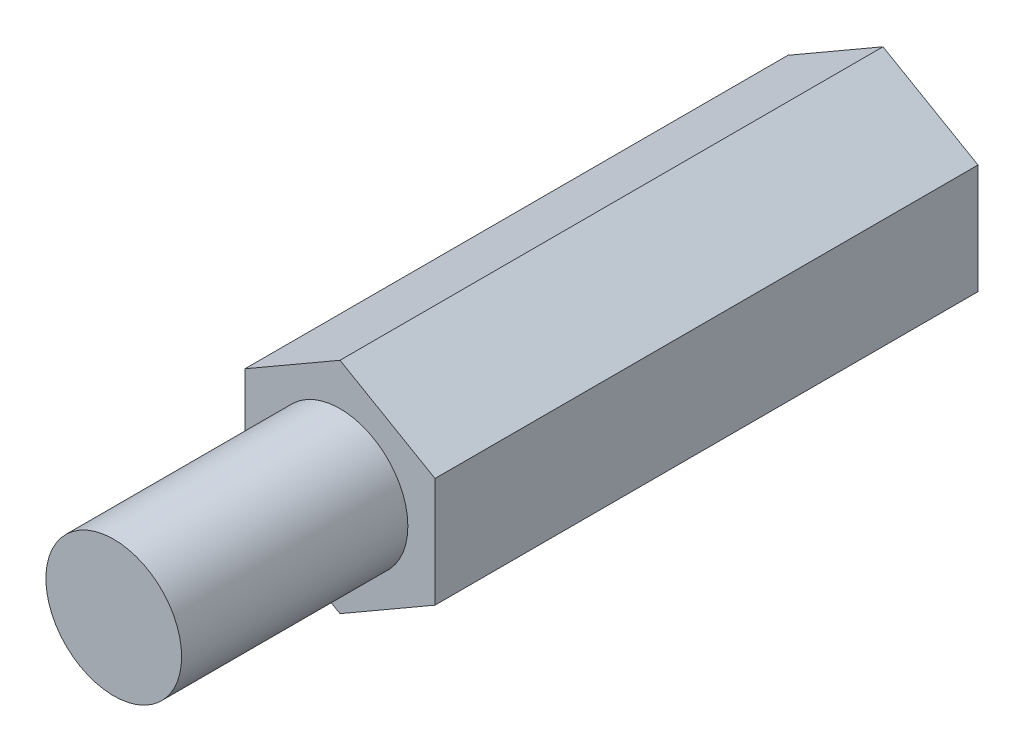
ISO-10303-21;
HEADER;
FILE_DESCRIPTION(('STEP AP214'),'2;1');
FILE_NAME('part.step','',(''),(''),'','','');
FILE_SCHEMA(('AUTOMOTIVE_DESIGN { 1 0 10303 214 1 1 1 1 }'));
ENDSEC;
DATA;
#1=APPLICATION_CONTEXT('core data for automotive mechanical design processes');
#2=APPLICATION_PROTOCOL_DEFINITION('international standard','automotive_design',2000,#1);
#3=PRODUCT_CONTEXT('',#1,'mechanical');
#4=PRODUCT('Part','Part','',(#3));
#5=PRODUCT_RELATED_PRODUCT_CATEGORY('part','',(#4));
#6=PRODUCT_DEFINITION_FORMATION('','',#4);
#7=PRODUCT_DEFINITION_CONTEXT('part definition',#1,'design');
#8=PRODUCT_DEFINITION('design','',#6,#7);
#9=PRODUCT_DEFINITION_SHAPE('','',#8);
#10=(LENGTH_UNIT() NAMED_UNIT(*) SI_UNIT(.MILLI.,.METRE.));
#11=(NAMED_UNIT(*) PLANE_ANGLE_UNIT() SI_UNIT($,.RADIAN.));
#12=(NAMED_UNIT(*) SI_UNIT($,.STERADIAN.) SOLID_ANGLE_UNIT());
#13=UNCERTAINTY_MEASURE_WITH_UNIT(LENGTH_MEASURE(1.E-05),#10,'distance_accuracy_value','');
#14=(GEOMETRIC_REPRESENTATION_CONTEXT(3) GLOBAL_UNCERTAINTY_ASSIGNED_CONTEXT((#13)) GLOBAL_UNIT_ASSIGNED_CONTEXT((#10,
#11,#12)) REPRESENTATION_CONTEXT('',''));
#15=CARTESIAN_POINT('',(0.,0.,0.));
#16=DIRECTION('',(0.,0.,1.));
#17=DIRECTION('',(1.,0.,0.));
#18=AXIS2_PLACEMENT_3D('',#15,#16,#17);
#19=CARTESIAN_POINT('',(0.,0.,0.));
#20=DIRECTION('',(0.,0.,1.));
#21=DIRECTION('',(1.,0.,0.));
#22=AXIS2_PLACEMENT_3D('',#19,#20,#21);
#23=PLANE('',#22);
#24=DIRECTION('',(-0.866025403784441,0.499999999999995,0.));
#25=VECTOR('',#24,1.);
#26=CARTESIAN_POINT('',(2.09999999999999,1.21243556529824,0.));
#27=LINE('',#26,#25);
#28=CARTESIAN_POINT('',(2.09999999999999,1.21243556529824,0.));
#29=VERTEX_POINT('',#28);
#30=CARTESIAN_POINT('',(0.,2.42487113059643,0.));
#31=VERTEX_POINT('',#30);
#32=EDGE_CURVE('E146',#29,#31,#27,.T.);
#33=ORIENTED_EDGE('',*,*,#32,.F.);
#34=DIRECTION('',(0.,1.,0.));
#35=VECTOR('',#34,1.);
#36=CARTESIAN_POINT('',(2.10000000000001,-1.2124355652982,0.));
#37=LINE('',#36,#35);
#38=CARTESIAN_POINT('',(2.10000000000001,-1.2124355652982,0.));
#39=VERTEX_POINT('',#38);
#40=EDGE_CURVE('E58',#39,#29,#37,.T.);
#41=ORIENTED_EDGE('',*,*,#40,.F.);
#42=DIRECTION('',(0.866025403784435,0.500000000000007,0.));
#43=VECTOR('',#42,1.);
#44=CARTESIAN_POINT('',(0.,-2.42487113059643,0.));
#45=LINE('',#44,#43);
#46=CARTESIAN_POINT('',(0.,-2.42487113059643,0.));
#47=VERTEX_POINT('',#46);
#48=EDGE_CURVE('E66',#47,#39,#45,.T.);
#49=ORIENTED_EDGE('',*,*,#48,.F.);
#50=DIRECTION('',(0.866025403784441,-0.499999999999995,0.));
#51=VECTOR('',#50,1.);
#52=CARTESIAN_POINT('',(-2.1,-1.21243556529822,0.));
#53=LINE('',#52,#51);
#54=CARTESIAN_POINT('',(-2.1,-1.21243556529822,0.));
#55=VERTEX_POINT('',#54);
#56=EDGE_CURVE('E155',#55,#47,#53,.T.);
#57=ORIENTED_EDGE('',*,*,#56,.F.);
#58=DIRECTION('',(0.,-1.,0.));
#59=VECTOR('',#58,1.);
#60=CARTESIAN_POINT('',(-2.1,1.21243556529821,0.));
#61=LINE('',#60,#59);
#62=CARTESIAN_POINT('',(-2.1,1.21243556529821,0.));
#63=VERTEX_POINT('',#62);
#64=EDGE_CURVE('E152',#63,#55,#61,.T.);
#65=ORIENTED_EDGE('',*,*,#64,.F.);
#66=DIRECTION('',(-0.866025403784438,-0.500000000000001,0.));
#67=VECTOR('',#66,1.);
#68=CARTESIAN_POINT('',(0.,2.42487113059643,0.));
#69=LINE('',#68,#67);
#70=EDGE_CURVE('E149',#31,#63,#69,.T.);
#71=ORIENTED_EDGE('',*,*,#70,.F.);
#72=EDGE_LOOP('',(#33,#41,#49,#57,#65,#71));
#73=FACE_BOUND('',#72,.T.);
#74=CARTESIAN_POINT('',(0.,0.,0.));
#75=DIRECTION('',(0.,0.,1.));
#76=DIRECTION('',(1.,0.,0.));
#77=AXIS2_PLACEMENT_3D('',#74,#75,#76);
#78=CIRCLE('',#77,1.5);
#79=CARTESIAN_POINT('',(1.5,0.,0.));
#80=VERTEX_POINT('',#79);
#81=EDGE_CURVE('E142',#80,#80,#78,.T.);
#82=ORIENTED_EDGE('',*,*,#81,.T.);
#83=EDGE_LOOP('',(#82));
#84=FACE_BOUND('',#83,.T.);
#85=ADVANCED_FACE('F41',(#73,#84),#23,.F.);
#86=CARTESIAN_POINT('',(2.09999999999999,1.21243556529824,10.));
#87=DIRECTION('',(-0.499999999999995,-0.866025403784441,0.));
#88=DIRECTION('',(0.866025403784442,-0.499999999999995,0.));
#89=AXIS2_PLACEMENT_3D('',#86,#87,#88);
#90=PLANE('',#89);
#91=ORIENTED_EDGE('',*,*,#32,.T.);
#92=DIRECTION('',(0.,0.,-1.));
#93=VECTOR('',#92,1.);
#94=CARTESIAN_POINT('',(0.,2.42487113059643,10.));
#95=LINE('',#94,#93);
#96=CARTESIAN_POINT('',(0.,2.42487113059643,12.));
#97=VERTEX_POINT('',#96);
#98=EDGE_CURVE('E45',#97,#31,#95,.T.);
#99=ORIENTED_EDGE('',*,*,#98,.F.);
#100=DIRECTION('',(-0.866025403784441,0.499999999999995,0.));
#101=VECTOR('',#100,1.);
#102=CARTESIAN_POINT('',(2.09999999999999,1.21243556529824,12.));
#103=LINE('',#102,#101);
#104=CARTESIAN_POINT('',(2.09999999999999,1.21243556529824,12.));
#105=VERTEX_POINT('',#104);
#106=EDGE_CURVE('E107',#105,#97,#103,.T.);
#107=ORIENTED_EDGE('',*,*,#106,.F.);
#108=DIRECTION('',(0.,0.,-1.));
#109=VECTOR('',#108,1.);
#110=CARTESIAN_POINT('',(2.09999999999999,1.21243556529824,10.));
#111=LINE('',#110,#109);
#112=EDGE_CURVE('E95',#105,#29,#111,.T.);
#113=ORIENTED_EDGE('',*,*,#112,.T.);
#114=EDGE_LOOP('',(#91,#99,#107,#113));
#115=FACE_BOUND('',#114,.T.);
#116=ADVANCED_FACE('F43',(#115),#90,.F.);
#117=CARTESIAN_POINT('',(0.,2.42487113059643,10.));
#118=DIRECTION('',(0.500000000000001,-0.866025403784438,0.));
#119=DIRECTION('',(0.866025403784438,0.500000000000001,0.));
#120=AXIS2_PLACEMENT_3D('',#117,#118,#119);
#121=PLANE('',#120);
#122=ORIENTED_EDGE('',*,*,#70,.T.);
#123=DIRECTION('',(0.,0.,-1.));
#124=VECTOR('',#123,1.);
#125=CARTESIAN_POINT('',(-2.1,1.21243556529821,10.));
#126=LINE('',#125,#124);
#127=CARTESIAN_POINT('',(-2.1,1.21243556529821,12.));
#128=VERTEX_POINT('',#127);
#129=EDGE_CURVE('E170',#128,#63,#126,.T.);
#130=ORIENTED_EDGE('',*,*,#129,.F.);
#131=DIRECTION('',(-0.866025403784438,-0.500000000000001,0.));
#132=VECTOR('',#131,1.);
#133=CARTESIAN_POINT('',(0.,2.42487113059643,12.));
#134=LINE('',#133,#132);
#135=EDGE_CURVE('E113',#97,#128,#134,.T.);
#136=ORIENTED_EDGE('',*,*,#135,.F.);
#137=ORIENTED_EDGE('',*,*,#98,.T.);
#138=EDGE_LOOP('',(#122,#130,#136,#137));
#139=FACE_BOUND('',#138,.T.);
#140=ADVANCED_FACE('F178',(#139),#121,.F.);
#141=CARTESIAN_POINT('',(-2.1,1.21243556529821,10.));
#142=DIRECTION('',(1.,0.,0.));
#143=DIRECTION('',(0.,1.,0.));
#144=AXIS2_PLACEMENT_3D('',#141,#142,#143);
#145=PLANE('',#144);
#146=ORIENTED_EDGE('',*,*,#64,.T.);
#147=DIRECTION('',(0.,0.,-1.));
#148=VECTOR('',#147,1.);
#149=CARTESIAN_POINT('',(-2.1,-1.21243556529822,10.));
#150=LINE('',#149,#148);
#151=CARTESIAN_POINT('',(-2.1,-1.21243556529822,12.));
#152=VERTEX_POINT('',#151);
#153=EDGE_CURVE('E167',#152,#55,#150,.T.);
#154=ORIENTED_EDGE('',*,*,#153,.F.);
#155=DIRECTION('',(0.,-1.,0.));
#156=VECTOR('',#155,1.);
#157=CARTESIAN_POINT('',(-2.1,1.21243556529821,12.));
#158=LINE('',#157,#156);
#159=EDGE_CURVE('E129',#128,#152,#158,.T.);
#160=ORIENTED_EDGE('',*,*,#159,.F.);
#161=ORIENTED_EDGE('',*,*,#129,.T.);
#162=EDGE_LOOP('',(#146,#154,#160,#161));
#163=FACE_BOUND('',#162,.T.);
#164=ADVANCED_FACE('F182',(#163),#145,.F.);
#165=CARTESIAN_POINT('',(-2.1,-1.21243556529822,10.));
#166=DIRECTION('',(0.499999999999995,0.866025403784442,0.));
#167=DIRECTION('',(-0.866025403784442,0.499999999999995,0.));
#168=AXIS2_PLACEMENT_3D('',#165,#166,#167);
#169=PLANE('',#168);
#170=ORIENTED_EDGE('',*,*,#56,.T.);
#171=DIRECTION('',(0.,0.,-1.));
#172=VECTOR('',#171,1.);
#173=CARTESIAN_POINT('',(0.,-2.42487113059643,10.));
#174=LINE('',#173,#172);
#175=CARTESIAN_POINT('',(0.,-2.42487113059643,12.));
#176=VERTEX_POINT('',#175);
#177=EDGE_CURVE('E164',#176,#47,#174,.T.);
#178=ORIENTED_EDGE('',*,*,#177,.F.);
#179=DIRECTION('',(0.866025403784441,-0.499999999999995,0.));
#180=VECTOR('',#179,1.);
#181=CARTESIAN_POINT('',(-2.1,-1.21243556529822,12.));
#182=LINE('',#181,#180);
#183=EDGE_CURVE('E133',#152,#176,#182,.T.);
#184=ORIENTED_EDGE('',*,*,#183,.F.);
#185=ORIENTED_EDGE('',*,*,#153,.T.);
#186=EDGE_LOOP('',(#170,#178,#184,#185));
#187=FACE_BOUND('',#186,.T.);
#188=ADVANCED_FACE('F185',(#187),#169,.F.);
#189=CARTESIAN_POINT('',(0.,-2.42487113059643,10.));
#190=DIRECTION('',(-0.500000000000007,0.866025403784434,0.));
#191=DIRECTION('',(-0.866025403784435,-0.500000000000007,0.));
#192=AXIS2_PLACEMENT_3D('',#189,#190,#191);
#193=PLANE('',#192);
#194=ORIENTED_EDGE('',*,*,#48,.T.);
#195=DIRECTION('',(0.,0.,-1.));
#196=VECTOR('',#195,1.);
#197=CARTESIAN_POINT('',(2.10000000000001,-1.2124355652982,10.));
#198=LINE('',#197,#196);
#199=CARTESIAN_POINT('',(2.10000000000001,-1.2124355652982,12.));
#200=VERTEX_POINT('',#199);
#201=EDGE_CURVE('E104',#200,#39,#198,.T.);
#202=ORIENTED_EDGE('',*,*,#201,.F.);
#203=DIRECTION('',(0.866025403784435,0.500000000000007,0.));
#204=VECTOR('',#203,1.);
#205=CARTESIAN_POINT('',(0.,-2.42487113059643,12.));
#206=LINE('',#205,#204);
#207=EDGE_CURVE('E119',#176,#200,#206,.T.);
#208=ORIENTED_EDGE('',*,*,#207,.F.);
#209=ORIENTED_EDGE('',*,*,#177,.T.);
#210=EDGE_LOOP('',(#194,#202,#208,#209));
#211=FACE_BOUND('',#210,.T.);
#212=ADVANCED_FACE('F186',(#211),#193,.F.);
#213=CARTESIAN_POINT('',(2.10000000000001,-1.2124355652982,10.));
#214=DIRECTION('',(-1.,0.,0.));
#215=DIRECTION('',(0.,-1.,0.));
#216=AXIS2_PLACEMENT_3D('',#213,#214,#215);
#217=PLANE('',#216);
#218=ORIENTED_EDGE('',*,*,#40,.T.);
#219=ORIENTED_EDGE('',*,*,#112,.F.);
#220=DIRECTION('',(0.,1.,0.));
#221=VECTOR('',#220,1.);
#222=CARTESIAN_POINT('',(2.10000000000001,-1.2124355652982,12.));
#223=LINE('',#222,#221);
#224=EDGE_CURVE('E99',#200,#105,#223,.T.);
#225=ORIENTED_EDGE('',*,*,#224,.F.);
#226=ORIENTED_EDGE('',*,*,#201,.T.);
#227=EDGE_LOOP('',(#218,#219,#225,#226));
#228=FACE_BOUND('',#227,.T.);
#229=ADVANCED_FACE('F97',(#228),#217,.F.);
#230=CARTESIAN_POINT('',(0.,0.,10.));
#231=DIRECTION('',(0.,0.,-1.));
#232=DIRECTION('',(-1.,0.,0.));
#233=AXIS2_PLACEMENT_3D('',#230,#231,#232);
#234=CYLINDRICAL_SURFACE('',#233,1.5);
#235=CARTESIAN_POINT('',(0.,0.,10.));
#236=DIRECTION('',(0.,0.,1.));
#237=DIRECTION('',(1.,0.,0.));
#238=AXIS2_PLACEMENT_3D('',#235,#236,#237);
#239=CIRCLE('',#238,1.5);
#240=CARTESIAN_POINT('',(1.5,0.,10.));
#241=VERTEX_POINT('',#240);
#242=EDGE_CURVE('E138',#241,#241,#239,.T.);
#243=ORIENTED_EDGE('',*,*,#242,.T.);
#244=EDGE_LOOP('',(#243));
#245=FACE_BOUND('',#244,.T.);
#246=ORIENTED_EDGE('',*,*,#81,.F.);
#247=EDGE_LOOP('',(#246));
#248=FACE_BOUND('',#247,.T.);
#249=ADVANCED_FACE('F193',(#245,#248),#234,.F.);
#250=CARTESIAN_POINT('',(0.,0.,10.));
#251=DIRECTION('',(0.,0.,1.));
#252=DIRECTION('',(1.,0.,0.));
#253=AXIS2_PLACEMENT_3D('',#250,#251,#252);
#254=PLANE('',#253);
#255=ORIENTED_EDGE('',*,*,#242,.F.);
#256=EDGE_LOOP('',(#255));
#257=FACE_BOUND('',#256,.T.);
#258=ADVANCED_FACE('F204',(#257),#254,.F.);
#259=CARTESIAN_POINT('',(0.,0.,12.));
#260=DIRECTION('',(0.,0.,1.));
#261=DIRECTION('',(1.,0.,0.));
#262=AXIS2_PLACEMENT_3D('',#259,#260,#261);
#263=PLANE('',#262);
#264=CARTESIAN_POINT('',(0.,0.,12.));
#265=DIRECTION('',(0.,0.,1.));
#266=DIRECTION('',(1.,0.,0.));
#267=AXIS2_PLACEMENT_3D('',#264,#265,#266);
#268=CIRCLE('',#267,1.5);
#269=CARTESIAN_POINT('',(1.5,0.,12.));
#270=VERTEX_POINT('',#269);
#271=EDGE_CURVE('E11',#270,#270,#268,.T.);
#272=ORIENTED_EDGE('',*,*,#271,.F.);
#273=EDGE_LOOP('',(#272));
#274=FACE_BOUND('',#273,.T.);
#275=ORIENTED_EDGE('',*,*,#224,.T.);
#276=ORIENTED_EDGE('',*,*,#106,.T.);
#277=ORIENTED_EDGE('',*,*,#135,.T.);
#278=ORIENTED_EDGE('',*,*,#159,.T.);
#279=ORIENTED_EDGE('',*,*,#183,.T.);
#280=ORIENTED_EDGE('',*,*,#207,.T.);
#281=EDGE_LOOP('',(#275,#276,#277,#278,#279,#280));
#282=FACE_BOUND('',#281,.T.);
#283=ADVANCED_FACE('F116',(#274,#282),#263,.T.);
#284=CARTESIAN_POINT('',(0.,0.,17.));
#285=DIRECTION('',(0.,0.,-1.));
#286=DIRECTION('',(-1.,0.,0.));
#287=AXIS2_PLACEMENT_3D('',#284,#285,#286);
#288=CYLINDRICAL_SURFACE('',#287,1.5);
#289=CARTESIAN_POINT('',(0.,0.,17.));
#290=DIRECTION('',(0.,0.,1.));
#291=DIRECTION('',(1.,0.,0.));
#292=AXIS2_PLACEMENT_3D('',#289,#290,#291);
#293=CIRCLE('',#292,1.5);
#294=CARTESIAN_POINT('',(1.5,0.,17.));
#295=VERTEX_POINT('',#294);
#296=EDGE_CURVE('E121',#295,#295,#293,.T.);
#297=ORIENTED_EDGE('',*,*,#296,.F.);
#298=EDGE_LOOP('',(#297));
#299=FACE_BOUND('',#298,.T.);
#300=ORIENTED_EDGE('',*,*,#271,.T.);
#301=EDGE_LOOP('',(#300));
#302=FACE_BOUND('',#301,.T.);
#303=ADVANCED_FACE('F211',(#299,#302),#288,.T.);
#304=CARTESIAN_POINT('',(0.,0.,17.));
#305=DIRECTION('',(0.,0.,1.));
#306=DIRECTION('',(1.,0.,0.));
#307=AXIS2_PLACEMENT_3D('',#304,#305,#306);
#308=PLANE('',#307);
#309=ORIENTED_EDGE('',*,*,#296,.T.);
#310=EDGE_LOOP('',(#309));
#311=FACE_BOUND('',#310,.T.);
#312=ADVANCED_FACE('F215',(#311),#308,.T.);
#313=CLOSED_SHELL('',(#85,#116,#140,#164,#188,#212,#229,#249,#258,#283,#303,#312));
#314=MANIFOLD_SOLID_BREP('B2',#313);
#315=ADVANCED_BREP_SHAPE_REPRESENTATION('',(#18,#314),#14);
#316=SHAPE_DEFINITION_REPRESENTATION(#9,#315);
ENDSEC;
END-ISO-10303-21;
